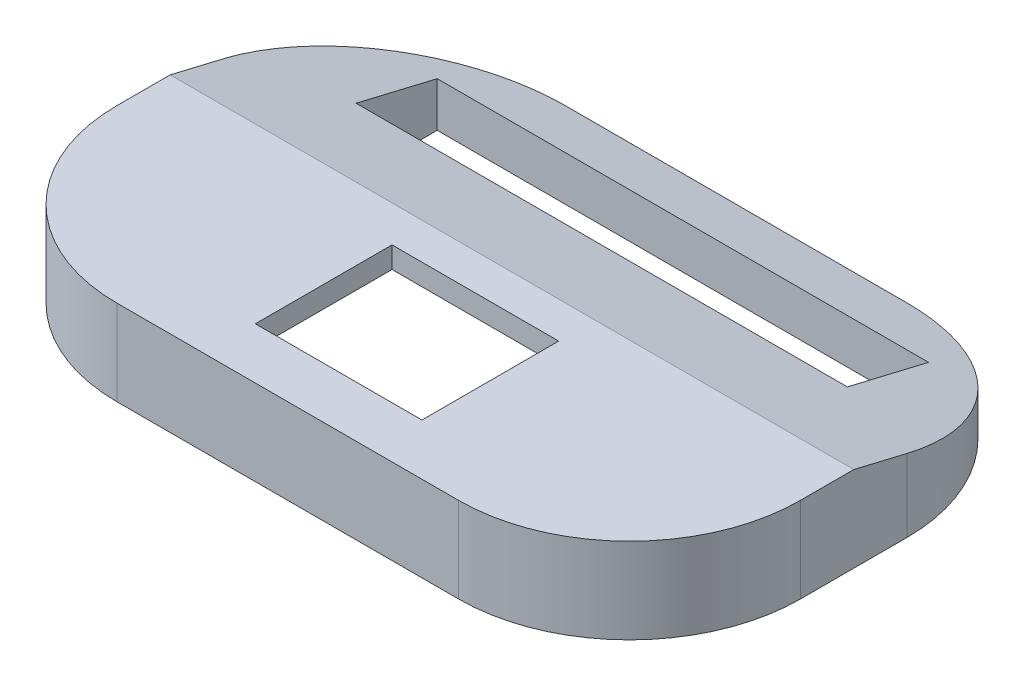
ISO-10303-21;
HEADER;
FILE_DESCRIPTION(('STEP AP214'),'2;1');
FILE_NAME('part.step','',(''),(''),'','','');
FILE_SCHEMA(('AUTOMOTIVE_DESIGN { 1 0 10303 214 1 1 1 1 }'));
ENDSEC;
DATA;
#1=APPLICATION_CONTEXT('core data for automotive mechanical design processes');
#2=APPLICATION_PROTOCOL_DEFINITION('international standard','automotive_design',2000,#1);
#3=PRODUCT_CONTEXT('',#1,'mechanical');
#4=PRODUCT('Part','Part','',(#3));
#5=PRODUCT_RELATED_PRODUCT_CATEGORY('part','',(#4));
#6=PRODUCT_DEFINITION_FORMATION('','',#4);
#7=PRODUCT_DEFINITION_CONTEXT('part definition',#1,'design');
#8=PRODUCT_DEFINITION('design','',#6,#7);
#9=PRODUCT_DEFINITION_SHAPE('','',#8);
#10=(LENGTH_UNIT() NAMED_UNIT(*) SI_UNIT(.MILLI.,.METRE.));
#11=(NAMED_UNIT(*) PLANE_ANGLE_UNIT() SI_UNIT($,.RADIAN.));
#12=(NAMED_UNIT(*) SI_UNIT($,.STERADIAN.) SOLID_ANGLE_UNIT());
#13=UNCERTAINTY_MEASURE_WITH_UNIT(LENGTH_MEASURE(1.E-05),#10,'distance_accuracy_value','');
#14=(GEOMETRIC_REPRESENTATION_CONTEXT(3) GLOBAL_UNCERTAINTY_ASSIGNED_CONTEXT((#13)) GLOBAL_UNIT_ASSIGNED_CONTEXT((#10,
#11,#12)) REPRESENTATION_CONTEXT('',''));
#15=CARTESIAN_POINT('',(0.,0.,0.));
#16=DIRECTION('',(0.,0.,1.));
#17=DIRECTION('',(1.,0.,0.));
#18=AXIS2_PLACEMENT_3D('',#15,#16,#17);
#19=CARTESIAN_POINT('',(40.,20.,-52.5));
#20=DIRECTION('',(0.,0.,1.));
#21=DIRECTION('',(1.,0.,0.));
#22=AXIS2_PLACEMENT_3D('',#19,#20,#21);
#23=PLANE('',#22);
#24=DIRECTION('',(1.,0.,0.));
#25=VECTOR('',#24,1.);
#26=CARTESIAN_POINT('',(-80.,7.5,-52.5));
#27=LINE('',#26,#25);
#28=CARTESIAN_POINT('',(-40.,7.5,-52.5));
#29=VERTEX_POINT('',#28);
#30=CARTESIAN_POINT('',(40.,7.5,-52.5));
#31=VERTEX_POINT('',#30);
#32=EDGE_CURVE('E197',#29,#31,#27,.T.);
#33=ORIENTED_EDGE('',*,*,#32,.T.);
#34=DIRECTION('',(0.,-1.,0.));
#35=VECTOR('',#34,1.);
#36=CARTESIAN_POINT('',(40.,20.,-52.5));
#37=LINE('',#36,#35);
#38=CARTESIAN_POINT('',(40.,0.,-52.5));
#39=VERTEX_POINT('',#38);
#40=EDGE_CURVE('E215',#31,#39,#37,.T.);
#41=ORIENTED_EDGE('',*,*,#40,.T.);
#42=DIRECTION('',(-1.,0.,0.));
#43=VECTOR('',#42,1.);
#44=CARTESIAN_POINT('',(40.,0.,-52.5));
#45=LINE('',#44,#43);
#46=CARTESIAN_POINT('',(-40.,0.,-52.5));
#47=VERTEX_POINT('',#46);
#48=EDGE_CURVE('E224',#39,#47,#45,.T.);
#49=ORIENTED_EDGE('',*,*,#48,.T.);
#50=DIRECTION('',(0.,-1.,0.));
#51=VECTOR('',#50,1.);
#52=CARTESIAN_POINT('',(-40.,20.,-52.5));
#53=LINE('',#52,#51);
#54=EDGE_CURVE('E273',#29,#47,#53,.T.);
#55=ORIENTED_EDGE('',*,*,#54,.F.);
#56=EDGE_LOOP('',(#33,#41,#49,#55));
#57=FACE_BOUND('',#56,.T.);
#58=ADVANCED_FACE('F41',(#57),#23,.F.);
#59=CARTESIAN_POINT('',(-40.,20.,-12.5));
#60=DIRECTION('',(0.,-1.,0.));
#61=DIRECTION('',(0.,0.,-1.));
#62=AXIS2_PLACEMENT_3D('',#59,#60,#61);
#63=CYLINDRICAL_SURFACE('',#62,40.);
#64=CARTESIAN_POINT('',(-40.,17.0238095238095,-12.5));
#65=DIRECTION('',(0.,0.972806214685367,-0.23162052730604));
#66=DIRECTION('',(0.,-0.23162052730604,-0.972806214685367));
#67=AXIS2_PLACEMENT_3D('',#64,#65,#66);
#68=ELLIPSE('',#67,41.1181583712817,40.);
#69=CARTESIAN_POINT('',(-80.,17.0238095238095,-12.5));
#70=VERTEX_POINT('',#69);
#71=EDGE_CURVE('E385',#29,#70,#68,.T.);
#72=ORIENTED_EDGE('',*,*,#71,.F.);
#73=ORIENTED_EDGE('',*,*,#54,.T.);
#74=CARTESIAN_POINT('',(-40.,0.,-12.5));
#75=DIRECTION('',(0.,1.,0.));
#76=DIRECTION('',(0.,0.,1.));
#77=AXIS2_PLACEMENT_3D('',#74,#75,#76);
#78=CIRCLE('',#77,40.);
#79=CARTESIAN_POINT('',(-80.,0.,-12.5));
#80=VERTEX_POINT('',#79);
#81=EDGE_CURVE('E228',#47,#80,#78,.T.);
#82=ORIENTED_EDGE('',*,*,#81,.T.);
#83=DIRECTION('',(0.,-1.,0.));
#84=VECTOR('',#83,1.);
#85=CARTESIAN_POINT('',(-80.,20.,-12.5));
#86=LINE('',#85,#84);
#87=EDGE_CURVE('E270',#70,#80,#86,.T.);
#88=ORIENTED_EDGE('',*,*,#87,.F.);
#89=EDGE_LOOP('',(#72,#73,#82,#88));
#90=FACE_BOUND('',#89,.T.);
#91=ADVANCED_FACE('F474',(#90),#63,.T.);
#92=CARTESIAN_POINT('',(-80.,20.,12.5));
#93=DIRECTION('',(-1.,0.,0.));
#94=DIRECTION('',(0.,0.,1.));
#95=AXIS2_PLACEMENT_3D('',#92,#93,#94);
#96=PLANE('',#95);
#97=DIRECTION('',(0.,0.,-1.));
#98=VECTOR('',#97,1.);
#99=CARTESIAN_POINT('',(-80.,20.,12.5));
#100=LINE('',#99,#98);
#101=CARTESIAN_POINT('',(-80.,20.,12.5));
#102=VERTEX_POINT('',#101);
#103=CARTESIAN_POINT('',(-80.,20.,0.));
#104=VERTEX_POINT('',#103);
#105=EDGE_CURVE('E254',#102,#104,#100,.T.);
#106=ORIENTED_EDGE('',*,*,#105,.T.);
#107=DIRECTION('',(0.,0.23162052730604,0.972806214685367));
#108=VECTOR('',#107,1.);
#109=CARTESIAN_POINT('',(-80.,20.,0.));
#110=LINE('',#109,#108);
#111=EDGE_CURVE('E56',#70,#104,#110,.T.);
#112=ORIENTED_EDGE('',*,*,#111,.F.);
#113=ORIENTED_EDGE('',*,*,#87,.T.);
#114=DIRECTION('',(0.,0.,-1.));
#115=VECTOR('',#114,1.);
#116=CARTESIAN_POINT('',(-80.,0.,12.5));
#117=LINE('',#116,#115);
#118=CARTESIAN_POINT('',(-80.,0.,12.5));
#119=VERTEX_POINT('',#118);
#120=EDGE_CURVE('E233',#119,#80,#117,.T.);
#121=ORIENTED_EDGE('',*,*,#120,.F.);
#122=DIRECTION('',(0.,-1.,0.));
#123=VECTOR('',#122,1.);
#124=CARTESIAN_POINT('',(-80.,20.,12.5));
#125=LINE('',#124,#123);
#126=EDGE_CURVE('E267',#102,#119,#125,.T.);
#127=ORIENTED_EDGE('',*,*,#126,.F.);
#128=EDGE_LOOP('',(#106,#112,#113,#121,#127));
#129=FACE_BOUND('',#128,.T.);
#130=ADVANCED_FACE('F476',(#129),#96,.T.);
#131=CARTESIAN_POINT('',(80.,20.,12.5));
#132=DIRECTION('',(-1.,0.,0.));
#133=DIRECTION('',(0.,0.,1.));
#134=AXIS2_PLACEMENT_3D('',#131,#132,#133);
#135=PLANE('',#134);
#136=DIRECTION('',(0.,0.23162052730604,0.972806214685367));
#137=VECTOR('',#136,1.);
#138=CARTESIAN_POINT('',(80.,20.,0.));
#139=LINE('',#138,#137);
#140=CARTESIAN_POINT('',(80.,17.0238095238095,-12.5));
#141=VERTEX_POINT('',#140);
#142=CARTESIAN_POINT('',(80.,20.,0.));
#143=VERTEX_POINT('',#142);
#144=EDGE_CURVE('E189',#141,#143,#139,.T.);
#145=ORIENTED_EDGE('',*,*,#144,.T.);
#146=DIRECTION('',(0.,0.,-1.));
#147=VECTOR('',#146,1.);
#148=CARTESIAN_POINT('',(80.,20.,12.5));
#149=LINE('',#148,#147);
#150=CARTESIAN_POINT('',(80.,20.,12.5));
#151=VERTEX_POINT('',#150);
#152=EDGE_CURVE('E204',#151,#143,#149,.T.);
#153=ORIENTED_EDGE('',*,*,#152,.F.);
#154=DIRECTION('',(0.,-1.,0.));
#155=VECTOR('',#154,1.);
#156=CARTESIAN_POINT('',(80.,20.,12.5));
#157=LINE('',#156,#155);
#158=CARTESIAN_POINT('',(80.,0.,12.5));
#159=VERTEX_POINT('',#158);
#160=EDGE_CURVE('E258',#151,#159,#157,.T.);
#161=ORIENTED_EDGE('',*,*,#160,.T.);
#162=DIRECTION('',(0.,0.,-1.));
#163=VECTOR('',#162,1.);
#164=CARTESIAN_POINT('',(80.,0.,12.5));
#165=LINE('',#164,#163);
#166=CARTESIAN_POINT('',(80.,0.,-12.5));
#167=VERTEX_POINT('',#166);
#168=EDGE_CURVE('E248',#159,#167,#165,.T.);
#169=ORIENTED_EDGE('',*,*,#168,.T.);
#170=DIRECTION('',(0.,-1.,0.));
#171=VECTOR('',#170,1.);
#172=CARTESIAN_POINT('',(80.,20.,-12.5));
#173=LINE('',#172,#171);
#174=EDGE_CURVE('E206',#141,#167,#173,.T.);
#175=ORIENTED_EDGE('',*,*,#174,.F.);
#176=EDGE_LOOP('',(#145,#153,#161,#169,#175));
#177=FACE_BOUND('',#176,.T.);
#178=ADVANCED_FACE('F202',(#177),#135,.F.);
#179=CARTESIAN_POINT('',(40.,20.,-12.5));
#180=DIRECTION('',(0.,-1.,0.));
#181=DIRECTION('',(0.,0.,-1.));
#182=AXIS2_PLACEMENT_3D('',#179,#180,#181);
#183=CYLINDRICAL_SURFACE('',#182,40.);
#184=CARTESIAN_POINT('',(40.,17.0238095238095,-12.5));
#185=DIRECTION('',(0.,0.972806214685367,-0.23162052730604));
#186=DIRECTION('',(0.,-0.23162052730604,-0.972806214685367));
#187=AXIS2_PLACEMENT_3D('',#184,#185,#186);
#188=ELLIPSE('',#187,41.1181583712817,40.);
#189=EDGE_CURVE('E382',#141,#31,#188,.T.);
#190=ORIENTED_EDGE('',*,*,#189,.F.);
#191=ORIENTED_EDGE('',*,*,#174,.T.);
#192=CARTESIAN_POINT('',(40.,0.,-12.5));
#193=DIRECTION('',(0.,1.,0.));
#194=DIRECTION('',(0.,0.,1.));
#195=AXIS2_PLACEMENT_3D('',#192,#193,#194);
#196=CIRCLE('',#195,40.);
#197=EDGE_CURVE('E251',#167,#39,#196,.T.);
#198=ORIENTED_EDGE('',*,*,#197,.T.);
#199=ORIENTED_EDGE('',*,*,#40,.F.);
#200=EDGE_LOOP('',(#190,#191,#198,#199));
#201=FACE_BOUND('',#200,.T.);
#202=ADVANCED_FACE('F381',(#201),#183,.T.);
#203=CARTESIAN_POINT('',(-40.,20.,-12.5));
#204=DIRECTION('',(0.,1.,0.));
#205=DIRECTION('',(0.,0.,1.));
#206=AXIS2_PLACEMENT_3D('',#203,#204,#205);
#207=PLANE('',#206);
#208=DIRECTION('',(0.,0.,-1.));
#209=VECTOR('',#208,1.);
#210=CARTESIAN_POINT('',(19.4206654675506,20.,40.5));
#211=LINE('',#210,#209);
#212=CARTESIAN_POINT('',(19.4206654675506,20.,40.5));
#213=VERTEX_POINT('',#212);
#214=CARTESIAN_POINT('',(19.4206654675506,20.,8.49999999999998));
#215=VERTEX_POINT('',#214);
#216=EDGE_CURVE('E330',#213,#215,#211,.T.);
#217=ORIENTED_EDGE('',*,*,#216,.F.);
#218=DIRECTION('',(1.,0.,0.));
#219=VECTOR('',#218,1.);
#220=CARTESIAN_POINT('',(19.4206654675506,20.,40.5));
#221=LINE('',#220,#219);
#222=CARTESIAN_POINT('',(-19.5793345324494,20.,40.5));
#223=VERTEX_POINT('',#222);
#224=EDGE_CURVE('E342',#223,#213,#221,.T.);
#225=ORIENTED_EDGE('',*,*,#224,.F.);
#226=DIRECTION('',(0.,0.,1.));
#227=VECTOR('',#226,1.);
#228=CARTESIAN_POINT('',(-19.5793345324494,20.,40.5));
#229=LINE('',#228,#227);
#230=CARTESIAN_POINT('',(-19.5793345324494,20.,8.49999999999999));
#231=VERTEX_POINT('',#230);
#232=EDGE_CURVE('E338',#231,#223,#229,.T.);
#233=ORIENTED_EDGE('',*,*,#232,.F.);
#234=DIRECTION('',(-1.,0.,0.));
#235=VECTOR('',#234,1.);
#236=CARTESIAN_POINT('',(19.4206654675506,20.,8.49999999999998));
#237=LINE('',#236,#235);
#238=EDGE_CURVE('E334',#215,#231,#237,.T.);
#239=ORIENTED_EDGE('',*,*,#238,.F.);
#240=EDGE_LOOP('',(#217,#225,#233,#239));
#241=FACE_BOUND('',#240,.T.);
#242=ORIENTED_EDGE('',*,*,#152,.T.);
#243=DIRECTION('',(1.,0.,0.));
#244=VECTOR('',#243,1.);
#245=CARTESIAN_POINT('',(-80.,20.,0.));
#246=LINE('',#245,#244);
#247=EDGE_CURVE('E186',#104,#143,#246,.T.);
#248=ORIENTED_EDGE('',*,*,#247,.F.);
#249=ORIENTED_EDGE('',*,*,#105,.F.);
#250=CARTESIAN_POINT('',(-40.,20.,12.5));
#251=DIRECTION('',(0.,1.,0.));
#252=DIRECTION('',(0.,0.,1.));
#253=AXIS2_PLACEMENT_3D('',#250,#251,#252);
#254=CIRCLE('',#253,40.);
#255=CARTESIAN_POINT('',(-40.,20.,52.5));
#256=VERTEX_POINT('',#255);
#257=EDGE_CURVE('E359',#102,#256,#254,.T.);
#258=ORIENTED_EDGE('',*,*,#257,.T.);
#259=DIRECTION('',(-1.,0.,0.));
#260=VECTOR('',#259,1.);
#261=CARTESIAN_POINT('',(40.,20.,52.5));
#262=LINE('',#261,#260);
#263=CARTESIAN_POINT('',(40.,20.,52.5));
#264=VERTEX_POINT('',#263);
#265=EDGE_CURVE('E220',#264,#256,#262,.T.);
#266=ORIENTED_EDGE('',*,*,#265,.F.);
#267=CARTESIAN_POINT('',(40.,20.,12.5));
#268=DIRECTION('',(0.,1.,0.));
#269=DIRECTION('',(0.,0.,1.));
#270=AXIS2_PLACEMENT_3D('',#267,#268,#269);
#271=CIRCLE('',#270,40.);
#272=EDGE_CURVE('E212',#264,#151,#271,.T.);
#273=ORIENTED_EDGE('',*,*,#272,.T.);
#274=EDGE_LOOP('',(#242,#248,#249,#258,#266,#273));
#275=FACE_BOUND('',#274,.T.);
#276=ADVANCED_FACE('F209',(#241,#275),#207,.T.);
#277=CARTESIAN_POINT('',(0.,15.,0.));
#278=DIRECTION('',(0.,-1.,0.));
#279=DIRECTION('',(0.,0.,-1.));
#280=AXIS2_PLACEMENT_3D('',#277,#278,#279);
#281=PLANE('',#280);
#282=DIRECTION('',(0.,0.,-1.));
#283=VECTOR('',#282,1.);
#284=CARTESIAN_POINT('',(19.4206654675506,15.,40.5));
#285=LINE('',#284,#283);
#286=CARTESIAN_POINT('',(19.4206654675506,15.,40.5));
#287=VERTEX_POINT('',#286);
#288=CARTESIAN_POINT('',(19.4206654675506,15.,8.49999999999998));
#289=VERTEX_POINT('',#288);
#290=EDGE_CURVE('E327',#287,#289,#285,.T.);
#291=ORIENTED_EDGE('',*,*,#290,.T.);
#292=DIRECTION('',(-1.,0.,0.));
#293=VECTOR('',#292,1.);
#294=CARTESIAN_POINT('',(19.4206654675506,15.,8.49999999999998));
#295=LINE('',#294,#293);
#296=CARTESIAN_POINT('',(-19.5793345324494,15.,8.49999999999999));
#297=VERTEX_POINT('',#296);
#298=EDGE_CURVE('E276',#289,#297,#295,.T.);
#299=ORIENTED_EDGE('',*,*,#298,.T.);
#300=DIRECTION('',(0.,0.,1.));
#301=VECTOR('',#300,1.);
#302=CARTESIAN_POINT('',(-19.5793345324494,15.,40.5));
#303=LINE('',#302,#301);
#304=CARTESIAN_POINT('',(-19.5793345324494,15.,40.5));
#305=VERTEX_POINT('',#304);
#306=EDGE_CURVE('E317',#297,#305,#303,.T.);
#307=ORIENTED_EDGE('',*,*,#306,.T.);
#308=DIRECTION('',(1.,0.,0.));
#309=VECTOR('',#308,1.);
#310=CARTESIAN_POINT('',(19.4206654675506,15.,40.5));
#311=LINE('',#310,#309);
#312=EDGE_CURVE('E324',#305,#287,#311,.T.);
#313=ORIENTED_EDGE('',*,*,#312,.T.);
#314=EDGE_LOOP('',(#291,#299,#307,#313));
#315=FACE_BOUND('',#314,.T.);
#316=DIRECTION('',(0.,0.,-1.));
#317=VECTOR('',#316,1.);
#318=CARTESIAN_POINT('',(-57.5,15.,-40.));
#319=LINE('',#318,#317);
#320=CARTESIAN_POINT('',(-57.5,15.,40.));
#321=VERTEX_POINT('',#320);
#322=CARTESIAN_POINT('',(-57.5,15.,-21.));
#323=VERTEX_POINT('',#322);
#324=EDGE_CURVE('E396',#321,#323,#319,.T.);
#325=ORIENTED_EDGE('',*,*,#324,.T.);
#326=DIRECTION('',(1.,0.,0.));
#327=VECTOR('',#326,1.);
#328=CARTESIAN_POINT('',(0.,15.,-21.));
#329=LINE('',#328,#327);
#330=CARTESIAN_POINT('',(57.5,15.,-21.));
#331=VERTEX_POINT('',#330);
#332=EDGE_CURVE('E386',#323,#331,#329,.T.);
#333=ORIENTED_EDGE('',*,*,#332,.T.);
#334=DIRECTION('',(0.,0.,1.));
#335=VECTOR('',#334,1.);
#336=CARTESIAN_POINT('',(57.5,15.,-40.));
#337=LINE('',#336,#335);
#338=CARTESIAN_POINT('',(57.5,15.,40.));
#339=VERTEX_POINT('',#338);
#340=EDGE_CURVE('E400',#331,#339,#337,.T.);
#341=ORIENTED_EDGE('',*,*,#340,.T.);
#342=DIRECTION('',(-1.,0.,0.));
#343=VECTOR('',#342,1.);
#344=CARTESIAN_POINT('',(57.5,15.,40.));
#345=LINE('',#344,#343);
#346=CARTESIAN_POINT('',(29.4206654675506,15.,40.));
#347=VERTEX_POINT('',#346);
#348=EDGE_CURVE('E404',#339,#347,#345,.T.);
#349=ORIENTED_EDGE('',*,*,#348,.T.);
#350=DIRECTION('',(0.,0.,1.));
#351=VECTOR('',#350,1.);
#352=CARTESIAN_POINT('',(29.4206654675506,15.,43.4956586286646));
#353=LINE('',#352,#351);
#354=CARTESIAN_POINT('',(29.4206654675506,15.,43.4956586286646));
#355=VERTEX_POINT('',#354);
#356=EDGE_CURVE('E287',#347,#355,#353,.T.);
#357=ORIENTED_EDGE('',*,*,#356,.T.);
#358=DIRECTION('',(-1.,0.,0.));
#359=VECTOR('',#358,1.);
#360=CARTESIAN_POINT('',(-29.5793345324494,15.,43.4956586286646));
#361=LINE('',#360,#359);
#362=CARTESIAN_POINT('',(-29.5793345324494,15.,43.4956586286646));
#363=VERTEX_POINT('',#362);
#364=EDGE_CURVE('E321',#355,#363,#361,.T.);
#365=ORIENTED_EDGE('',*,*,#364,.T.);
#366=DIRECTION('',(0.,0.,-1.));
#367=VECTOR('',#366,1.);
#368=CARTESIAN_POINT('',(-29.5793345324494,15.,43.4956586286646));
#369=LINE('',#368,#367);
#370=CARTESIAN_POINT('',(-29.5793345324494,15.,40.));
#371=VERTEX_POINT('',#370);
#372=EDGE_CURVE('E307',#363,#371,#369,.T.);
#373=ORIENTED_EDGE('',*,*,#372,.T.);
#374=EDGE_CURVE('E403',#371,#321,#345,.T.);
#375=ORIENTED_EDGE('',*,*,#374,.T.);
#376=EDGE_LOOP('',(#325,#333,#341,#349,#357,#365,#373,#375));
#377=FACE_BOUND('',#376,.T.);
#378=ADVANCED_FACE('F445',(#315,#377),#281,.T.);
#379=CARTESIAN_POINT('',(-57.5,15.,-40.));
#380=DIRECTION('',(-1.,0.,0.));
#381=DIRECTION('',(0.,0.,1.));
#382=AXIS2_PLACEMENT_3D('',#379,#380,#381);
#383=PLANE('',#382);
#384=DIRECTION('',(0.,-0.23162052730604,-0.972806214685367));
#385=VECTOR('',#384,1.);
#386=CARTESIAN_POINT('',(-57.5,10.7188841201717,-38.980686695279));
#387=LINE('',#386,#385);
#388=CARTESIAN_POINT('',(-57.5,10.4761904761905,-40.));
#389=VERTEX_POINT('',#388);
#390=EDGE_CURVE('E63',#323,#389,#387,.T.);
#391=ORIENTED_EDGE('',*,*,#390,.F.);
#392=ORIENTED_EDGE('',*,*,#324,.F.);
#393=DIRECTION('',(0.,-1.,0.));
#394=VECTOR('',#393,1.);
#395=CARTESIAN_POINT('',(-57.5,15.,40.));
#396=LINE('',#395,#394);
#397=CARTESIAN_POINT('',(-57.5,0.,40.));
#398=VERTEX_POINT('',#397);
#399=EDGE_CURVE('E422',#321,#398,#396,.T.);
#400=ORIENTED_EDGE('',*,*,#399,.T.);
#401=DIRECTION('',(0.,0.,-1.));
#402=VECTOR('',#401,1.);
#403=CARTESIAN_POINT('',(-57.5,0.,-40.));
#404=LINE('',#403,#402);
#405=CARTESIAN_POINT('',(-57.5,0.,-40.));
#406=VERTEX_POINT('',#405);
#407=EDGE_CURVE('E390',#398,#406,#404,.T.);
#408=ORIENTED_EDGE('',*,*,#407,.T.);
#409=DIRECTION('',(0.,-1.,0.));
#410=VECTOR('',#409,1.);
#411=CARTESIAN_POINT('',(-57.5,15.,-40.));
#412=LINE('',#411,#410);
#413=EDGE_CURVE('E407',#389,#406,#412,.T.);
#414=ORIENTED_EDGE('',*,*,#413,.F.);
#415=EDGE_LOOP('',(#391,#392,#400,#408,#414));
#416=FACE_BOUND('',#415,.T.);
#417=ADVANCED_FACE('F460',(#416),#383,.F.);
#418=CARTESIAN_POINT('',(57.5,15.,-40.));
#419=DIRECTION('',(1.,0.,0.));
#420=DIRECTION('',(0.,0.,-1.));
#421=AXIS2_PLACEMENT_3D('',#418,#419,#420);
#422=PLANE('',#421);
#423=DIRECTION('',(0.,0.23162052730604,0.972806214685367));
#424=VECTOR('',#423,1.);
#425=CARTESIAN_POINT('',(57.5,10.7188841201717,-38.9806866952789));
#426=LINE('',#425,#424);
#427=CARTESIAN_POINT('',(57.5,10.4761904761905,-40.));
#428=VERTEX_POINT('',#427);
#429=EDGE_CURVE('E196',#428,#331,#426,.T.);
#430=ORIENTED_EDGE('',*,*,#429,.F.);
#431=DIRECTION('',(0.,-1.,0.));
#432=VECTOR('',#431,1.);
#433=CARTESIAN_POINT('',(57.5,15.,-40.));
#434=LINE('',#433,#432);
#435=CARTESIAN_POINT('',(57.5,0.,-40.));
#436=VERTEX_POINT('',#435);
#437=EDGE_CURVE('E429',#428,#436,#434,.T.);
#438=ORIENTED_EDGE('',*,*,#437,.T.);
#439=DIRECTION('',(0.,0.,1.));
#440=VECTOR('',#439,1.);
#441=CARTESIAN_POINT('',(57.5,0.,-40.));
#442=LINE('',#441,#440);
#443=CARTESIAN_POINT('',(57.5,0.,40.));
#444=VERTEX_POINT('',#443);
#445=EDGE_CURVE('E415',#436,#444,#442,.T.);
#446=ORIENTED_EDGE('',*,*,#445,.T.);
#447=DIRECTION('',(0.,-1.,0.));
#448=VECTOR('',#447,1.);
#449=CARTESIAN_POINT('',(57.5,15.,40.));
#450=LINE('',#449,#448);
#451=EDGE_CURVE('E426',#339,#444,#450,.T.);
#452=ORIENTED_EDGE('',*,*,#451,.F.);
#453=ORIENTED_EDGE('',*,*,#340,.F.);
#454=EDGE_LOOP('',(#430,#438,#446,#452,#453));
#455=FACE_BOUND('',#454,.T.);
#456=ADVANCED_FACE('F546',(#455),#422,.F.);
#457=CARTESIAN_POINT('',(57.5,15.,-40.));
#458=DIRECTION('',(0.,0.,-1.));
#459=DIRECTION('',(-1.,0.,0.));
#460=AXIS2_PLACEMENT_3D('',#457,#458,#459);
#461=PLANE('',#460);
#462=DIRECTION('',(1.,0.,0.));
#463=VECTOR('',#462,1.);
#464=CARTESIAN_POINT('',(57.5,10.4761904761905,-40.));
#465=LINE('',#464,#463);
#466=EDGE_CURVE('E12',#389,#428,#465,.T.);
#467=ORIENTED_EDGE('',*,*,#466,.F.);
#468=ORIENTED_EDGE('',*,*,#413,.T.);
#469=DIRECTION('',(1.,0.,0.));
#470=VECTOR('',#469,1.);
#471=CARTESIAN_POINT('',(57.5,0.,-40.));
#472=LINE('',#471,#470);
#473=EDGE_CURVE('E411',#406,#436,#472,.T.);
#474=ORIENTED_EDGE('',*,*,#473,.T.);
#475=ORIENTED_EDGE('',*,*,#437,.F.);
#476=EDGE_LOOP('',(#467,#468,#474,#475));
#477=FACE_BOUND('',#476,.T.);
#478=ADVANCED_FACE('F554',(#477),#461,.F.);
#479=CARTESIAN_POINT('',(19.4206654675506,0.,40.5));
#480=DIRECTION('',(1.,0.,0.));
#481=DIRECTION('',(0.,0.,-1.));
#482=AXIS2_PLACEMENT_3D('',#479,#480,#481);
#483=PLANE('',#482);
#484=ORIENTED_EDGE('',*,*,#290,.F.);
#485=DIRECTION('',(0.,1.,0.));
#486=VECTOR('',#485,1.);
#487=CARTESIAN_POINT('',(19.4206654675506,0.,40.5));
#488=LINE('',#487,#486);
#489=EDGE_CURVE('E229',#287,#213,#488,.T.);
#490=ORIENTED_EDGE('',*,*,#489,.T.);
#491=ORIENTED_EDGE('',*,*,#216,.T.);
#492=DIRECTION('',(0.,1.,0.));
#493=VECTOR('',#492,1.);
#494=CARTESIAN_POINT('',(19.4206654675506,0.,8.49999999999998));
#495=LINE('',#494,#493);
#496=EDGE_CURVE('E346',#289,#215,#495,.T.);
#497=ORIENTED_EDGE('',*,*,#496,.F.);
#498=EDGE_LOOP('',(#484,#490,#491,#497));
#499=FACE_BOUND('',#498,.T.);
#500=ADVANCED_FACE('F563',(#499),#483,.F.);
#501=CARTESIAN_POINT('',(19.4206654675506,0.,40.5));
#502=DIRECTION('',(0.,0.,1.));
#503=DIRECTION('',(1.,0.,0.));
#504=AXIS2_PLACEMENT_3D('',#501,#502,#503);
#505=PLANE('',#504);
#506=ORIENTED_EDGE('',*,*,#312,.F.);
#507=DIRECTION('',(0.,1.,0.));
#508=VECTOR('',#507,1.);
#509=CARTESIAN_POINT('',(-19.5793345324494,0.,40.5));
#510=LINE('',#509,#508);
#511=EDGE_CURVE('E349',#305,#223,#510,.T.);
#512=ORIENTED_EDGE('',*,*,#511,.T.);
#513=ORIENTED_EDGE('',*,*,#224,.T.);
#514=ORIENTED_EDGE('',*,*,#489,.F.);
#515=EDGE_LOOP('',(#506,#512,#513,#514));
#516=FACE_BOUND('',#515,.T.);
#517=ADVANCED_FACE('F585',(#516),#505,.F.);
#518=CARTESIAN_POINT('',(-19.5793345324494,0.,40.5));
#519=DIRECTION('',(-1.,0.,0.));
#520=DIRECTION('',(0.,0.,1.));
#521=AXIS2_PLACEMENT_3D('',#518,#519,#520);
#522=PLANE('',#521);
#523=ORIENTED_EDGE('',*,*,#306,.F.);
#524=DIRECTION('',(0.,1.,0.));
#525=VECTOR('',#524,1.);
#526=CARTESIAN_POINT('',(-19.5793345324494,0.,8.49999999999999));
#527=LINE('',#526,#525);
#528=EDGE_CURVE('E352',#297,#231,#527,.T.);
#529=ORIENTED_EDGE('',*,*,#528,.T.);
#530=ORIENTED_EDGE('',*,*,#232,.T.);
#531=ORIENTED_EDGE('',*,*,#511,.F.);
#532=EDGE_LOOP('',(#523,#529,#530,#531));
#533=FACE_BOUND('',#532,.T.);
#534=ADVANCED_FACE('F588',(#533),#522,.F.);
#535=CARTESIAN_POINT('',(19.4206654675506,0.,8.49999999999998));
#536=DIRECTION('',(0.,0.,-1.));
#537=DIRECTION('',(-1.,0.,0.));
#538=AXIS2_PLACEMENT_3D('',#535,#536,#537);
#539=PLANE('',#538);
#540=ORIENTED_EDGE('',*,*,#298,.F.);
#541=ORIENTED_EDGE('',*,*,#496,.T.);
#542=ORIENTED_EDGE('',*,*,#238,.T.);
#543=ORIENTED_EDGE('',*,*,#528,.F.);
#544=EDGE_LOOP('',(#540,#541,#542,#543));
#545=FACE_BOUND('',#544,.T.);
#546=ADVANCED_FACE('F592',(#545),#539,.F.);
#547=CARTESIAN_POINT('',(-40.,20.,12.5));
#548=DIRECTION('',(0.,-1.,0.));
#549=DIRECTION('',(0.,0.,-1.));
#550=AXIS2_PLACEMENT_3D('',#547,#548,#549);
#551=CYLINDRICAL_SURFACE('',#550,40.);
#552=CARTESIAN_POINT('',(-40.,0.,12.5));
#553=DIRECTION('',(0.,1.,0.));
#554=DIRECTION('',(0.,0.,1.));
#555=AXIS2_PLACEMENT_3D('',#552,#553,#554);
#556=CIRCLE('',#555,40.);
#557=CARTESIAN_POINT('',(-40.,0.,52.5));
#558=VERTEX_POINT('',#557);
#559=EDGE_CURVE('E237',#119,#558,#556,.T.);
#560=ORIENTED_EDGE('',*,*,#559,.T.);
#561=DIRECTION('',(0.,-1.,0.));
#562=VECTOR('',#561,1.);
#563=CARTESIAN_POINT('',(-40.,20.,52.5));
#564=LINE('',#563,#562);
#565=EDGE_CURVE('E264',#256,#558,#564,.T.);
#566=ORIENTED_EDGE('',*,*,#565,.F.);
#567=ORIENTED_EDGE('',*,*,#257,.F.);
#568=ORIENTED_EDGE('',*,*,#126,.T.);
#569=EDGE_LOOP('',(#560,#566,#567,#568));
#570=FACE_BOUND('',#569,.T.);
#571=ADVANCED_FACE('F369',(#570),#551,.T.);
#572=CARTESIAN_POINT('',(40.,20.,52.5));
#573=DIRECTION('',(0.,0.,1.));
#574=DIRECTION('',(1.,0.,0.));
#575=AXIS2_PLACEMENT_3D('',#572,#573,#574);
#576=PLANE('',#575);
#577=DIRECTION('',(-1.,0.,0.));
#578=VECTOR('',#577,1.);
#579=CARTESIAN_POINT('',(40.,0.,52.5));
#580=LINE('',#579,#578);
#581=CARTESIAN_POINT('',(40.,0.,52.5));
#582=VERTEX_POINT('',#581);
#583=EDGE_CURVE('E241',#582,#558,#580,.T.);
#584=ORIENTED_EDGE('',*,*,#583,.F.);
#585=DIRECTION('',(0.,-1.,0.));
#586=VECTOR('',#585,1.);
#587=CARTESIAN_POINT('',(40.,20.,52.5));
#588=LINE('',#587,#586);
#589=EDGE_CURVE('E261',#264,#582,#588,.T.);
#590=ORIENTED_EDGE('',*,*,#589,.F.);
#591=ORIENTED_EDGE('',*,*,#265,.T.);
#592=ORIENTED_EDGE('',*,*,#565,.T.);
#593=EDGE_LOOP('',(#584,#590,#591,#592));
#594=FACE_BOUND('',#593,.T.);
#595=ADVANCED_FACE('F365',(#594),#576,.T.);
#596=CARTESIAN_POINT('',(40.,20.,12.5));
#597=DIRECTION('',(0.,-1.,0.));
#598=DIRECTION('',(0.,0.,-1.));
#599=AXIS2_PLACEMENT_3D('',#596,#597,#598);
#600=CYLINDRICAL_SURFACE('',#599,40.);
#601=CARTESIAN_POINT('',(40.,0.,12.5));
#602=DIRECTION('',(0.,1.,0.));
#603=DIRECTION('',(0.,0.,1.));
#604=AXIS2_PLACEMENT_3D('',#601,#602,#603);
#605=CIRCLE('',#604,40.);
#606=EDGE_CURVE('E245',#582,#159,#605,.T.);
#607=ORIENTED_EDGE('',*,*,#606,.T.);
#608=ORIENTED_EDGE('',*,*,#160,.F.);
#609=ORIENTED_EDGE('',*,*,#272,.F.);
#610=ORIENTED_EDGE('',*,*,#589,.T.);
#611=EDGE_LOOP('',(#607,#608,#609,#610));
#612=FACE_BOUND('',#611,.T.);
#613=ADVANCED_FACE('F377',(#612),#600,.T.);
#614=CARTESIAN_POINT('',(-40.,0.,-12.5));
#615=DIRECTION('',(0.,1.,0.));
#616=DIRECTION('',(0.,0.,1.));
#617=AXIS2_PLACEMENT_3D('',#614,#615,#616);
#618=PLANE('',#617);
#619=ORIENTED_EDGE('',*,*,#407,.F.);
#620=DIRECTION('',(-1.,0.,0.));
#621=VECTOR('',#620,1.);
#622=CARTESIAN_POINT('',(57.5,0.,40.));
#623=LINE('',#622,#621);
#624=CARTESIAN_POINT('',(-29.5793345324494,0.,40.));
#625=VERTEX_POINT('',#624);
#626=EDGE_CURVE('E419',#625,#398,#623,.T.);
#627=ORIENTED_EDGE('',*,*,#626,.F.);
#628=DIRECTION('',(0.,0.,-1.));
#629=VECTOR('',#628,1.);
#630=CARTESIAN_POINT('',(-29.5793345324494,0.,43.4956586286646));
#631=LINE('',#630,#629);
#632=CARTESIAN_POINT('',(-29.5793345324494,0.,43.4956586286646));
#633=VERTEX_POINT('',#632);
#634=EDGE_CURVE('E303',#633,#625,#631,.T.);
#635=ORIENTED_EDGE('',*,*,#634,.F.);
#636=DIRECTION('',(-1.,0.,0.));
#637=VECTOR('',#636,1.);
#638=CARTESIAN_POINT('',(-29.5793345324494,0.,43.4956586286646));
#639=LINE('',#638,#637);
#640=CARTESIAN_POINT('',(29.4206654675506,0.,43.4956586286646));
#641=VERTEX_POINT('',#640);
#642=EDGE_CURVE('E301',#641,#633,#639,.T.);
#643=ORIENTED_EDGE('',*,*,#642,.F.);
#644=DIRECTION('',(0.,0.,1.));
#645=VECTOR('',#644,1.);
#646=CARTESIAN_POINT('',(29.4206654675506,0.,43.4956586286646));
#647=LINE('',#646,#645);
#648=CARTESIAN_POINT('',(29.4206654675506,0.,40.));
#649=VERTEX_POINT('',#648);
#650=EDGE_CURVE('E285',#649,#641,#647,.T.);
#651=ORIENTED_EDGE('',*,*,#650,.F.);
#652=EDGE_CURVE('E298',#444,#649,#623,.T.);
#653=ORIENTED_EDGE('',*,*,#652,.F.);
#654=ORIENTED_EDGE('',*,*,#445,.F.);
#655=ORIENTED_EDGE('',*,*,#473,.F.);
#656=EDGE_LOOP('',(#619,#627,#635,#643,#651,#653,#654,#655));
#657=FACE_BOUND('',#656,.T.);
#658=ORIENTED_EDGE('',*,*,#48,.F.);
#659=ORIENTED_EDGE('',*,*,#197,.F.);
#660=ORIENTED_EDGE('',*,*,#168,.F.);
#661=ORIENTED_EDGE('',*,*,#606,.F.);
#662=ORIENTED_EDGE('',*,*,#583,.T.);
#663=ORIENTED_EDGE('',*,*,#559,.F.);
#664=ORIENTED_EDGE('',*,*,#120,.T.);
#665=ORIENTED_EDGE('',*,*,#81,.F.);
#666=EDGE_LOOP('',(#658,#659,#660,#661,#662,#663,#664,#665));
#667=FACE_BOUND('',#666,.T.);
#668=ADVANCED_FACE('F295',(#657,#667),#618,.F.);
#669=CARTESIAN_POINT('',(-29.5793345324494,15.,43.4956586286646));
#670=DIRECTION('',(-1.,0.,0.));
#671=DIRECTION('',(0.,0.,1.));
#672=AXIS2_PLACEMENT_3D('',#669,#670,#671);
#673=PLANE('',#672);
#674=ORIENTED_EDGE('',*,*,#634,.T.);
#675=DIRECTION('',(0.,1.,0.));
#676=VECTOR('',#675,1.);
#677=CARTESIAN_POINT('',(-29.5793345324494,15.,40.));
#678=LINE('',#677,#676);
#679=EDGE_CURVE('E310',#625,#371,#678,.T.);
#680=ORIENTED_EDGE('',*,*,#679,.T.);
#681=ORIENTED_EDGE('',*,*,#372,.F.);
#682=DIRECTION('',(0.,-1.,0.));
#683=VECTOR('',#682,1.);
#684=CARTESIAN_POINT('',(-29.5793345324494,15.,43.4956586286646));
#685=LINE('',#684,#683);
#686=EDGE_CURVE('E314',#363,#633,#685,.T.);
#687=ORIENTED_EDGE('',*,*,#686,.T.);
#688=EDGE_LOOP('',(#674,#680,#681,#687));
#689=FACE_BOUND('',#688,.T.);
#690=ADVANCED_FACE('F450',(#689),#673,.F.);
#691=CARTESIAN_POINT('',(-29.5793345324494,15.,43.4956586286646));
#692=DIRECTION('',(0.,0.,1.));
#693=DIRECTION('',(1.,0.,0.));
#694=AXIS2_PLACEMENT_3D('',#691,#692,#693);
#695=PLANE('',#694);
#696=ORIENTED_EDGE('',*,*,#642,.T.);
#697=ORIENTED_EDGE('',*,*,#686,.F.);
#698=ORIENTED_EDGE('',*,*,#364,.F.);
#699=DIRECTION('',(0.,-1.,0.));
#700=VECTOR('',#699,1.);
#701=CARTESIAN_POINT('',(29.4206654675506,15.,43.4956586286646));
#702=LINE('',#701,#700);
#703=EDGE_CURVE('E318',#355,#641,#702,.T.);
#704=ORIENTED_EDGE('',*,*,#703,.T.);
#705=EDGE_LOOP('',(#696,#697,#698,#704));
#706=FACE_BOUND('',#705,.T.);
#707=ADVANCED_FACE('F448',(#706),#695,.F.);
#708=CARTESIAN_POINT('',(29.4206654675506,15.,43.4956586286646));
#709=DIRECTION('',(1.,0.,0.));
#710=DIRECTION('',(0.,0.,-1.));
#711=AXIS2_PLACEMENT_3D('',#708,#709,#710);
#712=PLANE('',#711);
#713=ORIENTED_EDGE('',*,*,#356,.F.);
#714=DIRECTION('',(0.,-1.,0.));
#715=VECTOR('',#714,1.);
#716=CARTESIAN_POINT('',(29.4206654675506,15.,40.));
#717=LINE('',#716,#715);
#718=EDGE_CURVE('E49',#347,#649,#717,.T.);
#719=ORIENTED_EDGE('',*,*,#718,.T.);
#720=ORIENTED_EDGE('',*,*,#650,.T.);
#721=ORIENTED_EDGE('',*,*,#703,.F.);
#722=EDGE_LOOP('',(#713,#719,#720,#721));
#723=FACE_BOUND('',#722,.T.);
#724=ADVANCED_FACE('F283',(#723),#712,.F.);
#725=CARTESIAN_POINT('',(57.5,15.,40.));
#726=DIRECTION('',(0.,0.,1.));
#727=DIRECTION('',(1.,0.,0.));
#728=AXIS2_PLACEMENT_3D('',#725,#726,#727);
#729=PLANE('',#728);
#730=ORIENTED_EDGE('',*,*,#626,.T.);
#731=ORIENTED_EDGE('',*,*,#399,.F.);
#732=ORIENTED_EDGE('',*,*,#374,.F.);
#733=ORIENTED_EDGE('',*,*,#679,.F.);
#734=EDGE_LOOP('',(#730,#731,#732,#733));
#735=FACE_BOUND('',#734,.T.);
#736=ADVANCED_FACE('F453',(#735),#729,.F.);
#737=ORIENTED_EDGE('',*,*,#348,.F.);
#738=ORIENTED_EDGE('',*,*,#451,.T.);
#739=ORIENTED_EDGE('',*,*,#652,.T.);
#740=ORIENTED_EDGE('',*,*,#718,.F.);
#741=EDGE_LOOP('',(#737,#738,#739,#740));
#742=FACE_BOUND('',#741,.T.);
#743=ADVANCED_FACE('F494',(#742),#729,.F.);
#744=CARTESIAN_POINT('',(-80.,20.,0.));
#745=DIRECTION('',(0.,0.972806214685367,-0.23162052730604));
#746=DIRECTION('',(0.,0.23162052730604,0.972806214685367));
#747=AXIS2_PLACEMENT_3D('',#744,#745,#746);
#748=PLANE('',#747);
#749=ORIENTED_EDGE('',*,*,#390,.T.);
#750=ORIENTED_EDGE('',*,*,#466,.T.);
#751=ORIENTED_EDGE('',*,*,#429,.T.);
#752=ORIENTED_EDGE('',*,*,#332,.F.);
#753=EDGE_LOOP('',(#749,#750,#751,#752));
#754=FACE_BOUND('',#753,.T.);
#755=ORIENTED_EDGE('',*,*,#71,.T.);
#756=ORIENTED_EDGE('',*,*,#111,.T.);
#757=ORIENTED_EDGE('',*,*,#247,.T.);
#758=ORIENTED_EDGE('',*,*,#144,.F.);
#759=ORIENTED_EDGE('',*,*,#189,.T.);
#760=ORIENTED_EDGE('',*,*,#32,.F.);
#761=EDGE_LOOP('',(#755,#756,#757,#758,#759,#760));
#762=FACE_BOUND('',#761,.T.);
#763=ADVANCED_FACE('F188',(#754,#762),#748,.T.);
#764=CLOSED_SHELL('',(#58,#91,#130,#178,#202,#276,#378,#417,#456,#478,#500,#517,#534,#546,#571,
#595,#613,#668,#690,#707,#724,#736,#743,#763));
#765=MANIFOLD_SOLID_BREP('B2',#764);
#766=ADVANCED_BREP_SHAPE_REPRESENTATION('',(#18,#765),#14);
#767=SHAPE_DEFINITION_REPRESENTATION(#9,#766);
ENDSEC;
END-ISO-10303-21;
